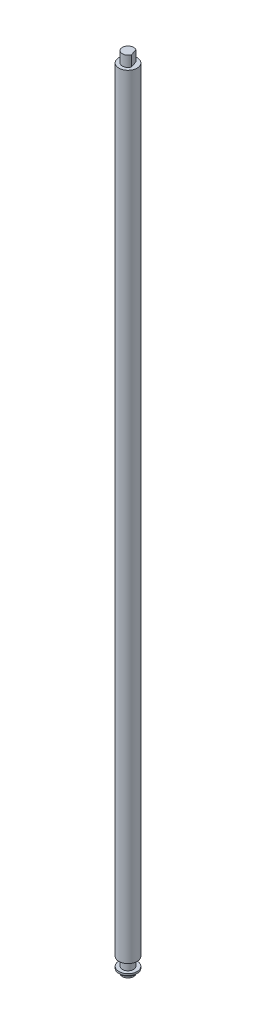
ISO-10303-21;
HEADER;
FILE_DESCRIPTION(('STEP AP214'),'2;1');
FILE_NAME('part.step','',(''),(''),'','','');
FILE_SCHEMA(('AUTOMOTIVE_DESIGN { 1 0 10303 214 1 1 1 1 }'));
ENDSEC;
DATA;
#1=APPLICATION_CONTEXT('core data for automotive mechanical design processes');
#2=APPLICATION_PROTOCOL_DEFINITION('international standard','automotive_design',2000,#1);
#3=PRODUCT_CONTEXT('',#1,'mechanical');
#4=PRODUCT('Part','Part','',(#3));
#5=PRODUCT_RELATED_PRODUCT_CATEGORY('part','',(#4));
#6=PRODUCT_DEFINITION_FORMATION('','',#4);
#7=PRODUCT_DEFINITION_CONTEXT('part definition',#1,'design');
#8=PRODUCT_DEFINITION('design','',#6,#7);
#9=PRODUCT_DEFINITION_SHAPE('','',#8);
#10=(LENGTH_UNIT() NAMED_UNIT(*) SI_UNIT(.MILLI.,.METRE.));
#11=(NAMED_UNIT(*) PLANE_ANGLE_UNIT() SI_UNIT($,.RADIAN.));
#12=(NAMED_UNIT(*) SI_UNIT($,.STERADIAN.) SOLID_ANGLE_UNIT());
#13=UNCERTAINTY_MEASURE_WITH_UNIT(LENGTH_MEASURE(1.E-05),#10,'distance_accuracy_value','');
#14=(GEOMETRIC_REPRESENTATION_CONTEXT(3) GLOBAL_UNCERTAINTY_ASSIGNED_CONTEXT((#13)) GLOBAL_UNIT_ASSIGNED_CONTEXT((#10,
#11,#12)) REPRESENTATION_CONTEXT('',''));
#15=CARTESIAN_POINT('',(0.,0.,0.));
#16=DIRECTION('',(0.,0.,1.));
#17=DIRECTION('',(1.,0.,0.));
#18=AXIS2_PLACEMENT_3D('',#15,#16,#17);
#19=CARTESIAN_POINT('',(2.9,0.,0.));
#20=DIRECTION('',(0.,-1.,0.));
#21=DIRECTION('',(1.,0.,0.));
#22=AXIS2_PLACEMENT_3D('',#19,#20,#21);
#23=PLANE('',#22);
#24=CARTESIAN_POINT('',(0.,0.,0.));
#25=DIRECTION('',(0.,-1.,0.));
#26=DIRECTION('',(1.,0.,0.));
#27=AXIS2_PLACEMENT_3D('',#24,#25,#26);
#28=CIRCLE('',#27,2.9);
#29=CARTESIAN_POINT('',(2.9,0.,0.));
#30=VERTEX_POINT('',#29);
#31=EDGE_CURVE('E98',#30,#30,#28,.T.);
#32=ORIENTED_EDGE('',*,*,#31,.T.);
#33=EDGE_LOOP('',(#32));
#34=FACE_BOUND('',#33,.T.);
#35=ADVANCED_FACE('F35',(#34),#23,.T.);
#36=CARTESIAN_POINT('',(-1.01155825609571E-13,413.,0.));
#37=DIRECTION('',(0.,1.,0.));
#38=DIRECTION('',(-1.,0.,0.));
#39=AXIS2_PLACEMENT_3D('',#36,#37,#38);
#40=PLANE('',#39);
#41=DIRECTION('',(0.321475639767787,0.,0.946917849148432));
#42=VECTOR('',#41,1.);
#43=CARTESIAN_POINT('',(1.62713316586052,413.,-2.40050779222994));
#44=LINE('',#43,#42);
#45=CARTESIAN_POINT('',(1.62713316586052,413.,-2.40050779222994));
#46=VERTEX_POINT('',#45);
#47=CARTESIAN_POINT('',(2.75229790504777,413.,0.913704679789569));
#48=VERTEX_POINT('',#47);
#49=EDGE_CURVE('E62',#46,#48,#44,.T.);
#50=ORIENTED_EDGE('',*,*,#49,.F.);
#51=CARTESIAN_POINT('',(-1.01155825609571E-13,413.,0.));
#52=DIRECTION('',(0.,-1.,0.));
#53=DIRECTION('',(1.,0.,0.));
#54=AXIS2_PLACEMENT_3D('',#51,#52,#53);
#55=CIRCLE('',#54,2.90000000000005);
#56=EDGE_CURVE('E72',#48,#46,#55,.T.);
#57=ORIENTED_EDGE('',*,*,#56,.F.);
#58=EDGE_LOOP('',(#50,#57));
#59=FACE_BOUND('',#58,.T.);
#60=ADVANCED_FACE('F71',(#59),#40,.T.);
#61=CARTESIAN_POINT('',(0.,0.,0.));
#62=DIRECTION('',(0.,-1.,0.));
#63=DIRECTION('',(1.,0.,0.));
#64=AXIS2_PLACEMENT_3D('',#61,#62,#63);
#65=CYLINDRICAL_SURFACE('',#64,2.90000000000005);
#66=DIRECTION('',(0.,1.,0.));
#67=VECTOR('',#66,1.);
#68=CARTESIAN_POINT('',(1.62713316586052,407.5,-2.40050779222994));
#69=LINE('',#68,#67);
#70=CARTESIAN_POINT('',(1.62713316586052,407.5,-2.40050779222994));
#71=VERTEX_POINT('',#70);
#72=EDGE_CURVE('E59',#71,#46,#69,.T.);
#73=ORIENTED_EDGE('',*,*,#72,.F.);
#74=CARTESIAN_POINT('',(0.,407.5,0.));
#75=DIRECTION('',(0.,-1.,0.));
#76=DIRECTION('',(1.,0.,0.));
#77=AXIS2_PLACEMENT_3D('',#74,#75,#76);
#78=CIRCLE('',#77,2.90000000000005);
#79=CARTESIAN_POINT('',(2.75229790504778,407.5,0.913704679789568));
#80=VERTEX_POINT('',#79);
#81=EDGE_CURVE('E75',#80,#71,#78,.T.);
#82=ORIENTED_EDGE('',*,*,#81,.F.);
#83=DIRECTION('',(0.,1.,0.));
#84=VECTOR('',#83,1.);
#85=CARTESIAN_POINT('',(2.75229790504778,407.5,0.913704679789569));
#86=LINE('',#85,#84);
#87=EDGE_CURVE('E67',#80,#48,#86,.T.);
#88=ORIENTED_EDGE('',*,*,#87,.T.);
#89=ORIENTED_EDGE('',*,*,#56,.T.);
#90=EDGE_LOOP('',(#73,#82,#88,#89));
#91=FACE_BOUND('',#90,.T.);
#92=ADVANCED_FACE('F74',(#91),#65,.T.);
#93=CARTESIAN_POINT('',(2.89999999999995,407.5,0.));
#94=DIRECTION('',(0.,1.,0.));
#95=DIRECTION('',(-1.,0.,0.));
#96=AXIS2_PLACEMENT_3D('',#93,#94,#95);
#97=PLANE('',#96);
#98=ORIENTED_EDGE('',*,*,#81,.T.);
#99=DIRECTION('',(0.321475639767787,0.,0.946917849148432));
#100=VECTOR('',#99,1.);
#101=CARTESIAN_POINT('',(1.62713316586052,407.5,-2.40050779222994));
#102=LINE('',#101,#100);
#103=EDGE_CURVE('E49',#71,#80,#102,.T.);
#104=ORIENTED_EDGE('',*,*,#103,.T.);
#105=EDGE_LOOP('',(#98,#104));
#106=FACE_BOUND('',#105,.T.);
#107=CARTESIAN_POINT('',(0.,407.5,0.));
#108=DIRECTION('',(0.,-1.,0.));
#109=DIRECTION('',(1.,0.,0.));
#110=AXIS2_PLACEMENT_3D('',#107,#108,#109);
#111=CIRCLE('',#110,4.70000000000001);
#112=CARTESIAN_POINT('',(4.69999999999991,407.5,0.));
#113=VERTEX_POINT('',#112);
#114=EDGE_CURVE('E78',#113,#113,#111,.T.);
#115=ORIENTED_EDGE('',*,*,#114,.F.);
#116=EDGE_LOOP('',(#115));
#117=FACE_BOUND('',#116,.T.);
#118=ADVANCED_FACE('F127',(#106,#117),#97,.T.);
#119=CARTESIAN_POINT('',(0.,0.,0.));
#120=DIRECTION('',(0.,-1.,0.));
#121=DIRECTION('',(1.,0.,0.));
#122=AXIS2_PLACEMENT_3D('',#119,#120,#121);
#123=CYLINDRICAL_SURFACE('',#122,4.69999999999998);
#124=ORIENTED_EDGE('',*,*,#114,.T.);
#125=EDGE_LOOP('',(#124));
#126=FACE_BOUND('',#125,.T.);
#127=CARTESIAN_POINT('',(0.,7.7,0.));
#128=DIRECTION('',(0.,-1.,0.));
#129=DIRECTION('',(1.,0.,0.));
#130=AXIS2_PLACEMENT_3D('',#127,#128,#129);
#131=CIRCLE('',#130,4.69999999999996);
#132=CARTESIAN_POINT('',(4.69999999999996,7.7,0.));
#133=VERTEX_POINT('',#132);
#134=EDGE_CURVE('E83',#133,#133,#131,.T.);
#135=ORIENTED_EDGE('',*,*,#134,.F.);
#136=EDGE_LOOP('',(#135));
#137=FACE_BOUND('',#136,.T.);
#138=ADVANCED_FACE('F130',(#126,#137),#123,.T.);
#139=CARTESIAN_POINT('',(4.69999999999996,7.7,0.));
#140=DIRECTION('',(0.,-1.,0.));
#141=DIRECTION('',(1.,0.,0.));
#142=AXIS2_PLACEMENT_3D('',#139,#140,#141);
#143=PLANE('',#142);
#144=ORIENTED_EDGE('',*,*,#134,.T.);
#145=EDGE_LOOP('',(#144));
#146=FACE_BOUND('',#145,.T.);
#147=CARTESIAN_POINT('',(0.,7.7,0.));
#148=DIRECTION('',(0.,-1.,0.));
#149=DIRECTION('',(1.,0.,0.));
#150=AXIS2_PLACEMENT_3D('',#147,#148,#149);
#151=CIRCLE('',#150,2.9);
#152=CARTESIAN_POINT('',(2.89999999999999,7.7,0.));
#153=VERTEX_POINT('',#152);
#154=EDGE_CURVE('E86',#153,#153,#151,.T.);
#155=ORIENTED_EDGE('',*,*,#154,.F.);
#156=EDGE_LOOP('',(#155));
#157=FACE_BOUND('',#156,.T.);
#158=ADVANCED_FACE('F133',(#146,#157),#143,.T.);
#159=CARTESIAN_POINT('',(0.,0.,0.));
#160=DIRECTION('',(0.,-1.,0.));
#161=DIRECTION('',(1.,0.,0.));
#162=AXIS2_PLACEMENT_3D('',#159,#160,#161);
#163=CYLINDRICAL_SURFACE('',#162,2.9);
#164=ORIENTED_EDGE('',*,*,#154,.T.);
#165=EDGE_LOOP('',(#164));
#166=FACE_BOUND('',#165,.T.);
#167=CARTESIAN_POINT('',(0.,3.2,0.));
#168=DIRECTION('',(0.,-1.,0.));
#169=DIRECTION('',(1.,0.,0.));
#170=AXIS2_PLACEMENT_3D('',#167,#168,#169);
#171=CIRCLE('',#170,2.9);
#172=CARTESIAN_POINT('',(2.9,3.2,0.));
#173=VERTEX_POINT('',#172);
#174=EDGE_CURVE('E89',#173,#173,#171,.T.);
#175=ORIENTED_EDGE('',*,*,#174,.F.);
#176=EDGE_LOOP('',(#175));
#177=FACE_BOUND('',#176,.T.);
#178=ADVANCED_FACE('F137',(#166,#177),#163,.T.);
#179=CARTESIAN_POINT('',(2.9,3.2,0.));
#180=DIRECTION('',(0.,1.,0.));
#181=DIRECTION('',(-1.,0.,0.));
#182=AXIS2_PLACEMENT_3D('',#179,#180,#181);
#183=PLANE('',#182);
#184=ORIENTED_EDGE('',*,*,#174,.T.);
#185=EDGE_LOOP('',(#184));
#186=FACE_BOUND('',#185,.T.);
#187=CARTESIAN_POINT('',(0.,3.2,0.));
#188=DIRECTION('',(0.,-1.,0.));
#189=DIRECTION('',(1.,0.,0.));
#190=AXIS2_PLACEMENT_3D('',#187,#188,#189);
#191=CIRCLE('',#190,4.69999999999996);
#192=CARTESIAN_POINT('',(4.69999999999996,3.2,0.));
#193=VERTEX_POINT('',#192);
#194=EDGE_CURVE('E92',#193,#193,#191,.T.);
#195=ORIENTED_EDGE('',*,*,#194,.F.);
#196=EDGE_LOOP('',(#195));
#197=FACE_BOUND('',#196,.T.);
#198=ADVANCED_FACE('F141',(#186,#197),#183,.T.);
#199=CARTESIAN_POINT('',(0.,0.,0.));
#200=DIRECTION('',(0.,-1.,0.));
#201=DIRECTION('',(1.,0.,0.));
#202=AXIS2_PLACEMENT_3D('',#199,#200,#201);
#203=CYLINDRICAL_SURFACE('',#202,4.69999999999996);
#204=CARTESIAN_POINT('',(0.,2.30000000000007,0.));
#205=DIRECTION('',(0.,-1.,0.));
#206=DIRECTION('',(1.,0.,0.));
#207=AXIS2_PLACEMENT_3D('',#204,#205,#206);
#208=CIRCLE('',#207,4.69999999999996);
#209=CARTESIAN_POINT('',(4.69999999999996,2.30000000000007,0.));
#210=VERTEX_POINT('',#209);
#211=EDGE_CURVE('E11',#210,#210,#208,.F.);
#212=ORIENTED_EDGE('',*,*,#211,.T.);
#213=EDGE_LOOP('',(#212));
#214=FACE_BOUND('',#213,.T.);
#215=ORIENTED_EDGE('',*,*,#194,.T.);
#216=EDGE_LOOP('',(#215));
#217=FACE_BOUND('',#216,.T.);
#218=ADVANCED_FACE('F115',(#214,#217),#203,.T.);
#219=CARTESIAN_POINT('',(4.69999999999996,1.5,0.));
#220=DIRECTION('',(0.,-1.,0.));
#221=DIRECTION('',(1.,0.,0.));
#222=AXIS2_PLACEMENT_3D('',#219,#220,#221);
#223=PLANE('',#222);
#224=CARTESIAN_POINT('',(0.,1.5,0.));
#225=DIRECTION('',(0.,-1.,0.));
#226=DIRECTION('',(1.,0.,0.));
#227=AXIS2_PLACEMENT_3D('',#224,#225,#226);
#228=CIRCLE('',#227,3.8999999999999);
#229=CARTESIAN_POINT('',(3.8999999999999,1.5,0.));
#230=VERTEX_POINT('',#229);
#231=EDGE_CURVE('E43',#230,#230,#228,.T.);
#232=ORIENTED_EDGE('',*,*,#231,.T.);
#233=EDGE_LOOP('',(#232));
#234=FACE_BOUND('',#233,.T.);
#235=CARTESIAN_POINT('',(0.,1.5,0.));
#236=DIRECTION('',(0.,-1.,0.));
#237=DIRECTION('',(1.,0.,0.));
#238=AXIS2_PLACEMENT_3D('',#235,#236,#237);
#239=CIRCLE('',#238,2.9);
#240=CARTESIAN_POINT('',(2.89999999999999,1.5,0.));
#241=VERTEX_POINT('',#240);
#242=EDGE_CURVE('E95',#241,#241,#239,.T.);
#243=ORIENTED_EDGE('',*,*,#242,.F.);
#244=EDGE_LOOP('',(#243));
#245=FACE_BOUND('',#244,.T.);
#246=ADVANCED_FACE('F107',(#234,#245),#223,.T.);
#247=CARTESIAN_POINT('',(0.,0.,0.));
#248=DIRECTION('',(0.,-1.,0.));
#249=DIRECTION('',(1.,0.,0.));
#250=AXIS2_PLACEMENT_3D('',#247,#248,#249);
#251=CYLINDRICAL_SURFACE('',#250,2.9);
#252=ORIENTED_EDGE('',*,*,#242,.T.);
#253=EDGE_LOOP('',(#252));
#254=FACE_BOUND('',#253,.T.);
#255=ORIENTED_EDGE('',*,*,#31,.F.);
#256=EDGE_LOOP('',(#255));
#257=FACE_BOUND('',#256,.T.);
#258=ADVANCED_FACE('F105',(#254,#257),#251,.T.);
#259=CARTESIAN_POINT('',(0.,1.5,0.));
#260=DIRECTION('',(0.,1.,0.));
#261=DIRECTION('',(-1.,0.,0.));
#262=AXIS2_PLACEMENT_3D('',#259,#260,#261);
#263=CONICAL_SURFACE('',#262,3.8999999999999,0.785398163397439);
#264=ORIENTED_EDGE('',*,*,#211,.F.);
#265=EDGE_LOOP('',(#264));
#266=FACE_BOUND('',#265,.T.);
#267=ORIENTED_EDGE('',*,*,#231,.F.);
#268=EDGE_LOOP('',(#267));
#269=FACE_BOUND('',#268,.T.);
#270=ADVANCED_FACE('F37',(#266,#269),#263,.T.);
#271=CARTESIAN_POINT('',(1.62713316586052,407.5,-2.40050779222994));
#272=DIRECTION('',(-0.946917849148432,0.,0.321475639767787));
#273=DIRECTION('',(0.321475639767787,0.,0.946917849148432));
#274=AXIS2_PLACEMENT_3D('',#271,#272,#273);
#275=PLANE('',#274);
#276=ORIENTED_EDGE('',*,*,#49,.T.);
#277=ORIENTED_EDGE('',*,*,#87,.F.);
#278=ORIENTED_EDGE('',*,*,#103,.F.);
#279=ORIENTED_EDGE('',*,*,#72,.T.);
#280=EDGE_LOOP('',(#276,#277,#278,#279));
#281=FACE_BOUND('',#280,.T.);
#282=ADVANCED_FACE('F61',(#281),#275,.F.);
#283=CLOSED_SHELL('',(#35,#60,#92,#118,#138,#158,#178,#198,#218,#246,#258,#270,#282));
#284=MANIFOLD_SOLID_BREP('B2',#283);
#285=ADVANCED_BREP_SHAPE_REPRESENTATION('',(#18,#284),#14);
#286=SHAPE_DEFINITION_REPRESENTATION(#9,#285);
ENDSEC;
END-ISO-10303-21;
